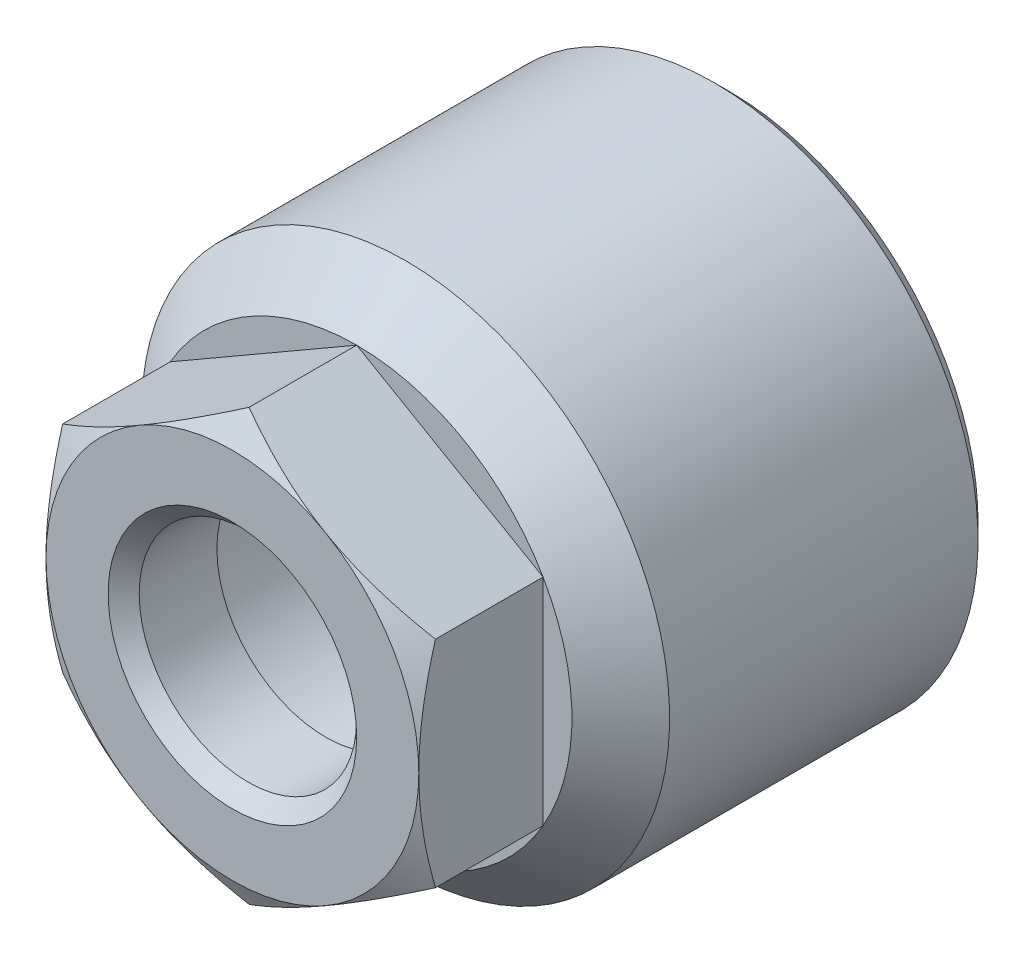
ISO-10303-21;
HEADER;
FILE_DESCRIPTION(('STEP AP214'),'2;1');
FILE_NAME('part.step','',(''),(''),'','','');
FILE_SCHEMA(('AUTOMOTIVE_DESIGN { 1 0 10303 214 1 1 1 1 }'));
ENDSEC;
DATA;
#1=APPLICATION_CONTEXT('core data for automotive mechanical design processes');
#2=APPLICATION_PROTOCOL_DEFINITION('international standard','automotive_design',2000,#1);
#3=PRODUCT_CONTEXT('',#1,'mechanical');
#4=PRODUCT('Part','Part','',(#3));
#5=PRODUCT_RELATED_PRODUCT_CATEGORY('part','',(#4));
#6=PRODUCT_DEFINITION_FORMATION('','',#4);
#7=PRODUCT_DEFINITION_CONTEXT('part definition',#1,'design');
#8=PRODUCT_DEFINITION('design','',#6,#7);
#9=PRODUCT_DEFINITION_SHAPE('','',#8);
#10=(LENGTH_UNIT() NAMED_UNIT(*) SI_UNIT(.MILLI.,.METRE.));
#11=(NAMED_UNIT(*) PLANE_ANGLE_UNIT() SI_UNIT($,.RADIAN.));
#12=(NAMED_UNIT(*) SI_UNIT($,.STERADIAN.) SOLID_ANGLE_UNIT());
#13=UNCERTAINTY_MEASURE_WITH_UNIT(LENGTH_MEASURE(1.E-05),#10,'distance_accuracy_value','');
#14=(GEOMETRIC_REPRESENTATION_CONTEXT(3) GLOBAL_UNCERTAINTY_ASSIGNED_CONTEXT((#13)) GLOBAL_UNIT_ASSIGNED_CONTEXT((#10,
#11,#12)) REPRESENTATION_CONTEXT('',''));
#15=CARTESIAN_POINT('',(0.,0.,0.));
#16=DIRECTION('',(0.,0.,1.));
#17=DIRECTION('',(1.,0.,0.));
#18=AXIS2_PLACEMENT_3D('',#15,#16,#17);
#19=CARTESIAN_POINT('',(11.9999999999999,6.92820323027565,-8.));
#20=DIRECTION('',(0.499999999999995,0.866025403784441,0.));
#21=DIRECTION('',(-0.866025403784441,0.499999999999995,0.));
#22=AXIS2_PLACEMENT_3D('',#19,#20,#21);
#23=PLANE('',#22);
#24=DIRECTION('',(0.,0.,1.));
#25=VECTOR('',#24,1.);
#26=CARTESIAN_POINT('',(0.,13.856406460551,-8.));
#27=LINE('',#26,#25);
#28=CARTESIAN_POINT('',(0.,13.856406460551,-8.));
#29=VERTEX_POINT('',#28);
#30=CARTESIAN_POINT('',(0.,13.856406460551,-1.07179676972444));
#31=VERTEX_POINT('',#30);
#32=EDGE_CURVE('E146',#29,#31,#27,.T.);
#33=ORIENTED_EDGE('',*,*,#32,.T.);
#34=CARTESIAN_POINT('',(-0.0002,13.8565219306049,-1.07186343722443));
#35=CARTESIAN_POINT('',(0.263585795242264,13.7042251307133,-0.983949632185819));
#36=CARTESIAN_POINT('',(0.528355119381802,13.5513604901482,-0.900025997556626));
#37=CARTESIAN_POINT('',(1.06001701652967,13.244405350712,-0.741266218872801));
#38=CARTESIAN_POINT('',(1.32691025729308,13.0903144663124,-0.666433063673542));
#39=CARTESIAN_POINT('',(2.13189040597902,12.6255589607763,-0.457017539854113));
#40=CARTESIAN_POINT('',(2.67315507382511,12.3130596590925,-0.337903236722815));
#41=CARTESIAN_POINT('',(3.48313282915501,11.8454187840152,-0.198231061003112));
#42=CARTESIAN_POINT('',(3.74942610048139,11.6916742921315,-0.158443797040413));
#43=CARTESIAN_POINT('',(4.28324559869686,11.3834734611381,-0.0917233692170604));
#44=CARTESIAN_POINT('',(4.5507718492174,11.2290171083848,-0.0647904527677457));
#45=CARTESIAN_POINT('',(5.08627036632538,10.9198468953819,-0.0244685919168988));
#46=CARTESIAN_POINT('',(5.35424172206875,10.7651335610083,-0.0110635528822929));
#47=CARTESIAN_POINT('',(5.89043273227407,10.4555635369293,0.00191690624285519));
#48=CARTESIAN_POINT('',(6.15865237880807,10.3007068518009,0.00149275363728714));
#49=CARTESIAN_POINT('',(6.66008937878413,10.0112020648831,-0.0122200193427528));
#50=CARTESIAN_POINT('',(6.89334249317778,9.87653331649861,-0.0238359825785117));
#51=CARTESIAN_POINT('',(7.35931224173078,9.60750555673731,-0.0573080088723605));
#52=CARTESIAN_POINT('',(7.59202883677178,9.4731465679455,-0.0791647962662012));
#53=CARTESIAN_POINT('',(8.05679907604294,9.20481134519097,-0.132737416542893));
#54=CARTESIAN_POINT('',(8.288852012362,9.07083551994092,-0.164461392492906));
#55=CARTESIAN_POINT('',(8.75186996730497,8.80351197901497,-0.237211775670422));
#56=CARTESIAN_POINT('',(8.98283491089352,8.67016430666075,-0.278238815183178));
#57=CARTESIAN_POINT('',(9.68394195876364,8.2653799638422,-0.41631165328178));
#58=CARTESIAN_POINT('',(10.1520537462785,7.99511549730967,-0.5271248883393));
#59=CARTESIAN_POINT('',(11.0812971075914,7.45861659251301,-0.77862576693785));
#60=CARTESIAN_POINT('',(11.5424405792921,7.19237528499157,-0.919254342659345));
#61=CARTESIAN_POINT('',(12.0001999999999,6.92808776022181,-1.07186343722443));
#62=B_SPLINE_CURVE_WITH_KNOTS('',3,(#34,#35,#36,#37,#38,#39,#40,#41,#42,#43,#44,#45,#46,#47,#48,
#49,#50,#51,#52,#53,#54,#55,#56,#57,#58,#59,#60,#61),.UNSPECIFIED.,.F.,.F.,(4,2,2,2,2,2,2,2,2,2,
2,2,2,4),(0.,0.951004872251246,1.90232158356438,3.80900466161369,4.73894551413571,
5.6689042647761,6.59775529889866,7.52657763276931,8.33514643820578,9.14377244252747,
9.95306755799761,10.7624176939263,12.4167102786891,14.067755631669),.UNSPECIFIED.);
#63=CARTESIAN_POINT('',(5.99999999999999,10.3923048454134,0.));
#64=VERTEX_POINT('',#63);
#65=EDGE_CURVE('E70',#31,#64,#62,.T.);
#66=ORIENTED_EDGE('',*,*,#65,.T.);
#67=CARTESIAN_POINT('',(11.9999999999999,6.92820323027565,-1.07179676972444));
#68=VERTEX_POINT('',#67);
#69=EDGE_CURVE('E117',#64,#68,#62,.T.);
#70=ORIENTED_EDGE('',*,*,#69,.T.);
#71=DIRECTION('',(0.,0.,1.));
#72=VECTOR('',#71,1.);
#73=CARTESIAN_POINT('',(11.9999999999999,6.92820323027565,-8.));
#74=LINE('',#73,#72);
#75=CARTESIAN_POINT('',(11.9999999999998,6.92820323027571,-7.99999999999996));
#76=VERTEX_POINT('',#75);
#77=EDGE_CURVE('E250',#76,#68,#74,.T.);
#78=ORIENTED_EDGE('',*,*,#77,.F.);
#79=DIRECTION('',(-0.866025403784441,0.499999999999995,0.));
#80=VECTOR('',#79,1.);
#81=CARTESIAN_POINT('',(11.9999999999999,6.92820323027565,-8.));
#82=LINE('',#81,#80);
#83=EDGE_CURVE('E422',#76,#29,#82,.T.);
#84=ORIENTED_EDGE('',*,*,#83,.T.);
#85=EDGE_LOOP('',(#33,#66,#70,#78,#84));
#86=FACE_BOUND('',#85,.T.);
#87=ADVANCED_FACE('F46',(#86),#23,.T.);
#88=CARTESIAN_POINT('',(12.0000000000001,-6.9282032302754,-8.));
#89=DIRECTION('',(1.,0.,0.));
#90=DIRECTION('',(0.,1.,0.));
#91=AXIS2_PLACEMENT_3D('',#88,#89,#90);
#92=PLANE('',#91);
#93=ORIENTED_EDGE('',*,*,#77,.T.);
#94=CARTESIAN_POINT('',(11.9999999999998,22.9284032302757,-8.01292205856069));
#95=CARTESIAN_POINT('',(11.9999999999998,22.3914038773246,-7.73826996089815));
#96=CARTESIAN_POINT('',(11.9999999999998,21.8535870807048,-7.46520156734985));
#97=CARTESIAN_POINT('',(11.9999999999998,20.775949369974,-6.92302201005071));
#98=CARTESIAN_POINT('',(11.9999999999998,20.2361284134909,-6.65391093056902));
#99=CARTESIAN_POINT('',(11.9999999999998,19.1532089274725,-6.11999050883258));
#100=CARTESIAN_POINT('',(11.9999999999998,18.6101063666815,-5.8551893280769));
#101=CARTESIAN_POINT('',(11.9999999999998,17.5210689493459,-5.33144602416146));
#102=CARTESIAN_POINT('',(11.9999999999998,16.9751340515705,-5.07250398659011));
#103=CARTESIAN_POINT('',(11.9999999999998,15.8519624269962,-4.54886615796039));
#104=CARTESIAN_POINT('',(11.9999999999998,15.2745483743149,-4.28454966307294));
#105=CARTESIAN_POINT('',(11.9999999999999,14.1151878281931,-3.76609444661759));
#106=CARTESIAN_POINT('',(11.9999999999999,13.5332415760901,-3.51195518748368));
#107=CARTESIAN_POINT('',(11.9999999999999,12.3641975501913,-3.01690552635542));
#108=CARTESIAN_POINT('',(11.9999999999999,11.7771035938207,-2.77598614814153));
#109=CARTESIAN_POINT('',(11.9999999999999,10.5960459363314,-2.31101275013836));
#110=CARTESIAN_POINT('',(11.9999999999999,10.0020805948474,-2.0869628575201));
#111=CARTESIAN_POINT('',(11.9999999999999,9.05181999011644,-1.74856276577053));
#112=CARTESIAN_POINT('',(11.9999999999999,8.69811619346075,-1.62695508814798));
#113=CARTESIAN_POINT('',(11.9999999999999,7.98771958508624,-1.3928259712592));
#114=CARTESIAN_POINT('',(11.9999999999999,7.63102667138014,-1.28030484342645));
#115=CARTESIAN_POINT('',(11.9999999999999,6.55643445068992,-0.958733729763835));
#116=CARTESIAN_POINT('',(11.9999999999999,5.83357958423612,-0.765514667030666));
#117=CARTESIAN_POINT('',(11.9999999999999,4.74645666585079,-0.51985263196518));
#118=CARTESIAN_POINT('',(12.,4.38701799906334,-0.445824709312143));
#119=CARTESIAN_POINT('',(12.,3.6652639874772,-0.313277091225055));
#120=CARTESIAN_POINT('',(12.,3.30294872042321,-0.254756978127329));
#121=CARTESIAN_POINT('',(12.,2.57610605370745,-0.154918538248956));
#122=CARTESIAN_POINT('',(12.,2.21157974521725,-0.113592331750669));
#123=CARTESIAN_POINT('',(12.,1.48088726329935,-0.0494438096510148));
#124=CARTESIAN_POINT('',(12.,1.11472110095573,-0.0266213691683051));
#125=CARTESIAN_POINT('',(12.,0.377402173746499,-0.000132405464725937));
#126=CARTESIAN_POINT('',(12.,0.00624114066922012,0.00330714157683311));
#127=CARTESIAN_POINT('',(12.,-0.735727355133803,-0.00970643523652931));
#128=CARTESIAN_POINT('',(12.,-1.10653481669313,-0.0261596244910789));
#129=CARTESIAN_POINT('',(12.,-1.84690043410361,-0.0783648733823472));
#130=CARTESIAN_POINT('',(12.,-2.21645814418443,-0.114123210912563));
#131=CARTESIAN_POINT('',(12.,-2.95334183650006,-0.203705544051641));
#132=CARTESIAN_POINT('',(12.,-3.3206677676507,-0.257529951608594));
#133=CARTESIAN_POINT('',(12.,-4.43267882588878,-0.446085792073235));
#134=CARTESIAN_POINT('',(12.0000000000001,-5.17304794526611,-0.606786574264474));
#135=CARTESIAN_POINT('',(12.0000000000001,-6.27309224914157,-0.887231827804943));
#136=CARTESIAN_POINT('',(12.0000000000001,-6.63808480252983,-0.987300129736838));
#137=CARTESIAN_POINT('',(12.0000000000001,-7.36481100466482,-1.19874844822463));
#138=CARTESIAN_POINT('',(12.0000000000001,-7.72654463252794,-1.31012853721188));
#139=CARTESIAN_POINT('',(12.0000000000001,-8.41775316117881,-1.53314339830441));
#140=CARTESIAN_POINT('',(12.0000000000001,-8.74747184641105,-1.64402967082626));
#141=CARTESIAN_POINT('',(12.0000000000001,-9.4044622923579,-1.87284520313324));
#142=CARTESIAN_POINT('',(12.0000000000001,-9.7317339717056,-1.99077469595528));
#143=CARTESIAN_POINT('',(12.0000000000001,-10.7102679375235,-2.35366353622876));
#144=CARTESIAN_POINT('',(12.0000000000001,-11.3581673861494,-2.60769632486128));
#145=CARTESIAN_POINT('',(12.0000000000001,-12.6471555923902,-3.13398837887719));
#146=CARTESIAN_POINT('',(12.0000000000001,-13.2882373091201,-3.40626469925147));
#147=CARTESIAN_POINT('',(12.0000000000002,-14.564369025296,-3.96441593510737));
#148=CARTESIAN_POINT('',(12.0000000000002,-15.1994195086154,-4.2502897484428));
#149=CARTESIAN_POINT('',(12.0000000000002,-16.4310266296783,-4.81697923189874));
#150=CARTESIAN_POINT('',(12.0000000000002,-17.0278330742653,-5.09725427553586));
#151=CARTESIAN_POINT('',(12.0000000000002,-18.2179326575289,-5.66519384067006));
#152=CARTESIAN_POINT('',(12.0000000000002,-18.8112256971348,-5.95285856933147));
#153=CARTESIAN_POINT('',(12.0000000000002,-19.9932102007579,-6.53324968369327));
#154=CARTESIAN_POINT('',(12.0000000000002,-20.58190998969,-6.82595914322132));
#155=CARTESIAN_POINT('',(12.0000000000002,-21.4631432450724,-7.26857581310798));
#156=CARTESIAN_POINT('',(12.0000000000002,-21.756573894556,-7.41670113041807));
#157=CARTESIAN_POINT('',(12.0000000000002,-22.342886784872,-7.71402997161241));
#158=CARTESIAN_POINT('',(12.0000000000002,-22.6357690282501,-7.86323349047591));
#159=CARTESIAN_POINT('',(12.0000000000002,-22.9284032302754,-8.0129220585607));
#160=B_SPLINE_CURVE_WITH_KNOTS('',3,(#94,#95,#96,#97,#98,#99,#100,#101,#102,#103,#104,#105,#106,
#107,#108,#109,#110,#111,#112,#113,#114,#115,#116,#117,#118,#119,#120,#121,#122,#123,#124,#125,
#126,#127,#128,#129,#130,#131,#132,#133,#134,#135,#136,#137,#138,#139,#140,#141,#142,#143,#144,
#145,#146,#147,#148,#149,#150,#151,#152,#153,#154,#155,#156,#157,#158,#159),.UNSPECIFIED.,.F.,
.F.,(4,2,2,2,2,2,2,2,2,2,2,2,2,2,2,2,2,2,2,2,2,2,2,2,2,2,2,2,2,2,2,2,4),(0.,1.809487490861,
3.61901345827234,5.43164016622181,7.24429333534566,9.14932416501831,11.0542542370534,
12.957874447692,14.8619588816329,15.9839158744573,17.1059113050622,19.3484919651268,
20.4491705858187,21.5498195594988,22.6499635646459,23.7501001448935,24.8630931133416,
25.9760897408903,27.0894485250328,28.20283269805,30.472607912963,31.6078912205663,
32.7431817980458,33.7866935981331,34.8302399437286,36.917590703643,39.0069208121503,
41.096081857424,43.074047795846,45.0520692457194,47.0244050092042,48.0104985229254,
48.9965874477745),.UNSPECIFIED.);
#161=CARTESIAN_POINT('',(12.0000000000001,1.26194426293922E-13,0.));
#162=VERTEX_POINT('',#161);
#163=EDGE_CURVE('E120',#68,#162,#160,.T.);
#164=ORIENTED_EDGE('',*,*,#163,.T.);
#165=CARTESIAN_POINT('',(12.0000000000001,-6.9282032302754,-1.07179676972444));
#166=VERTEX_POINT('',#165);
#167=EDGE_CURVE('E158',#162,#166,#160,.T.);
#168=ORIENTED_EDGE('',*,*,#167,.T.);
#169=DIRECTION('',(0.,0.,1.));
#170=VECTOR('',#169,1.);
#171=CARTESIAN_POINT('',(12.0000000000001,-6.9282032302754,-8.));
#172=LINE('',#171,#170);
#173=CARTESIAN_POINT('',(12.0000000000001,-6.92820323027503,-7.99999999999989));
#174=VERTEX_POINT('',#173);
#175=EDGE_CURVE('E254',#174,#166,#172,.T.);
#176=ORIENTED_EDGE('',*,*,#175,.F.);
#177=DIRECTION('',(0.,1.,0.));
#178=VECTOR('',#177,1.);
#179=CARTESIAN_POINT('',(12.0000000000001,-6.9282032302754,-8.));
#180=LINE('',#179,#178);
#181=EDGE_CURVE('E253',#174,#76,#180,.T.);
#182=ORIENTED_EDGE('',*,*,#181,.T.);
#183=EDGE_LOOP('',(#93,#164,#168,#176,#182));
#184=FACE_BOUND('',#183,.T.);
#185=ADVANCED_FACE('F217',(#184),#92,.T.);
#186=CARTESIAN_POINT('',(0.,-13.856406460551,-8.));
#187=DIRECTION('',(0.500000000000007,-0.866025403784435,0.));
#188=DIRECTION('',(0.866025403784435,0.500000000000007,0.));
#189=AXIS2_PLACEMENT_3D('',#186,#187,#188);
#190=PLANE('',#189);
#191=ORIENTED_EDGE('',*,*,#175,.T.);
#192=CARTESIAN_POINT('',(12.0002000000001,-6.92808776022156,-1.07186343722443));
#193=CARTESIAN_POINT('',(11.7364142047578,-7.08038456011308,-0.983949632185816));
#194=CARTESIAN_POINT('',(11.4716448806183,-7.2332492006782,-0.900025997556622));
#195=CARTESIAN_POINT('',(10.9399829834704,-7.54020434011439,-0.741266218872796));
#196=CARTESIAN_POINT('',(10.673089742707,-7.69429522451404,-0.666433063673537));
#197=CARTESIAN_POINT('',(9.86810959402107,-8.15905073005018,-0.457017539854105));
#198=CARTESIAN_POINT('',(9.32684492617498,-8.47155003173396,-0.337903236722801));
#199=CARTESIAN_POINT('',(8.51686717084509,-8.93919090681129,-0.198231061003096));
#200=CARTESIAN_POINT('',(8.25057389951871,-9.09293539869496,-0.158443797040396));
#201=CARTESIAN_POINT('',(7.71675440130325,-9.40113622968834,-0.0917233692170419));
#202=CARTESIAN_POINT('',(7.44922815078271,-9.55559258244167,-0.0647904527677252));
#203=CARTESIAN_POINT('',(6.91372963367474,-9.8647627954446,-0.0244685919168753));
#204=CARTESIAN_POINT('',(6.64575827793136,-10.0194761298182,-0.0110635528822682));
#205=CARTESIAN_POINT('',(6.10956726772606,-10.3290461538973,0.00191690624288258));
#206=CARTESIAN_POINT('',(5.84134762119206,-10.4839028390256,0.00149275363731606));
#207=CARTESIAN_POINT('',(5.33991062121599,-10.7734076259434,-0.012220019342722));
#208=CARTESIAN_POINT('',(5.10665750682234,-10.9080763743279,-0.0238359825784806));
#209=CARTESIAN_POINT('',(4.64068775826933,-11.1771041340892,-0.0573080088723289));
#210=CARTESIAN_POINT('',(4.40797116322833,-11.3114631228811,-0.0791647962661692));
#211=CARTESIAN_POINT('',(3.94320092395715,-11.5797983456356,-0.132737416542861));
#212=CARTESIAN_POINT('',(3.71114798763809,-11.7137741708856,-0.164461392492875));
#213=CARTESIAN_POINT('',(3.24813003269512,-11.9810977118116,-0.237211775670392));
#214=CARTESIAN_POINT('',(3.01716508910656,-12.1144453841658,-0.27823881518315));
#215=CARTESIAN_POINT('',(2.31605804123643,-12.5192297269844,-0.416311653281756));
#216=CARTESIAN_POINT('',(1.84794625372157,-12.789494193517,-0.527124888339279));
#217=CARTESIAN_POINT('',(0.918702892408676,-13.3259930983136,-0.778625766937838));
#218=CARTESIAN_POINT('',(0.457559420707943,-13.5922344058351,-0.919254342659338));
#219=CARTESIAN_POINT('',(-0.000199999999903364,-13.8565219306049,-1.07186343722443));
#220=B_SPLINE_CURVE_WITH_KNOTS('',3,(#192,#193,#194,#195,#196,#197,#198,#199,#200,#201,#202,
#203,#204,#205,#206,#207,#208,#209,#210,#211,#212,#213,#214,#215,#216,#217,#218,#219),
.UNSPECIFIED.,.F.,.F.,(4,2,2,2,2,2,2,2,2,2,2,2,2,4),(0.,0.951004872251245,1.90232158356438,
3.80900466161369,4.73894551413571,5.6689042647761,6.59775529889866,7.52657763276931,
8.3351464382058,9.1437724425275,9.95306755799767,10.7624176939264,12.4167102786892,
14.0677556316692),.UNSPECIFIED.);
#221=CARTESIAN_POINT('',(6.00000000000013,-10.3923048454133,0.));
#222=VERTEX_POINT('',#221);
#223=EDGE_CURVE('E211',#166,#222,#220,.T.);
#224=ORIENTED_EDGE('',*,*,#223,.T.);
#225=CARTESIAN_POINT('',(0.,-13.856406460551,-1.07179676972444));
#226=VERTEX_POINT('',#225);
#227=EDGE_CURVE('E204',#222,#226,#220,.T.);
#228=ORIENTED_EDGE('',*,*,#227,.T.);
#229=DIRECTION('',(0.,0.,1.));
#230=VECTOR('',#229,1.);
#231=CARTESIAN_POINT('',(0.,-13.856406460551,-8.));
#232=LINE('',#231,#230);
#233=CARTESIAN_POINT('',(5.27355936696949E-13,-13.8564064605508,-7.99999999999985));
#234=VERTEX_POINT('',#233);
#235=EDGE_CURVE('E258',#234,#226,#232,.T.);
#236=ORIENTED_EDGE('',*,*,#235,.F.);
#237=DIRECTION('',(0.866025403784435,0.500000000000007,0.));
#238=VECTOR('',#237,1.);
#239=CARTESIAN_POINT('',(0.,-13.856406460551,-8.));
#240=LINE('',#239,#238);
#241=EDGE_CURVE('E408',#234,#174,#240,.T.);
#242=ORIENTED_EDGE('',*,*,#241,.T.);
#243=EDGE_LOOP('',(#191,#224,#228,#236,#242));
#244=FACE_BOUND('',#243,.T.);
#245=ADVANCED_FACE('F213',(#244),#190,.T.);
#246=CARTESIAN_POINT('',(-12.,-6.92820323027557,-8.));
#247=DIRECTION('',(-0.499999999999995,-0.866025403784442,0.));
#248=DIRECTION('',(0.866025403784442,-0.499999999999995,0.));
#249=AXIS2_PLACEMENT_3D('',#246,#247,#248);
#250=PLANE('',#249);
#251=ORIENTED_EDGE('',*,*,#235,.T.);
#252=CARTESIAN_POINT('',(0.000200000000096759,-13.8565219306049,-1.07186343722443));
#253=CARTESIAN_POINT('',(-0.263585795242165,-13.7042251307133,-0.983949632185815));
#254=CARTESIAN_POINT('',(-0.528355119381704,-13.5513604901482,-0.900025997556621));
#255=CARTESIAN_POINT('',(-1.06001701652957,-13.244405350712,-0.741266218872795));
#256=CARTESIAN_POINT('',(-1.32691025729298,-13.0903144663124,-0.666433063673536));
#257=CARTESIAN_POINT('',(-2.13189040597892,-12.6255589607763,-0.457017539854104));
#258=CARTESIAN_POINT('',(-2.67315507382501,-12.3130596590925,-0.3379032367228));
#259=CARTESIAN_POINT('',(-3.48313282915491,-11.8454187840152,-0.198231061003095));
#260=CARTESIAN_POINT('',(-3.74942610048129,-11.6916742921315,-0.158443797040396));
#261=CARTESIAN_POINT('',(-4.28324559869676,-11.3834734611381,-0.0917233692170418));
#262=CARTESIAN_POINT('',(-4.5507718492173,-11.2290171083848,-0.0647904527677247));
#263=CARTESIAN_POINT('',(-5.08627036632528,-10.9198468953819,-0.0244685919168747));
#264=CARTESIAN_POINT('',(-5.35424172206865,-10.7651335610083,-0.011063552882268));
#265=CARTESIAN_POINT('',(-5.89043273227397,-10.4555635369293,0.00191690624288241));
#266=CARTESIAN_POINT('',(-6.15865237880797,-10.3007068518009,0.00149275363731601));
#267=CARTESIAN_POINT('',(-6.66008937878404,-10.0112020648831,-0.0122200193427219));
#268=CARTESIAN_POINT('',(-6.89334249317769,-9.8765333164986,-0.0238359825784806));
#269=CARTESIAN_POINT('',(-7.35931224173071,-9.6075055567373,-0.0573080088723284));
#270=CARTESIAN_POINT('',(-7.59202883677171,-9.47314656794548,-0.0791647962661683));
#271=CARTESIAN_POINT('',(-8.05679907604289,-9.20481134519094,-0.13273741654286));
#272=CARTESIAN_POINT('',(-8.28885201236195,-9.07083551994089,-0.164461392492875));
#273=CARTESIAN_POINT('',(-8.75186996730493,-8.80351197901494,-0.237211775670392));
#274=CARTESIAN_POINT('',(-8.98283491089349,-8.67016430666071,-0.27823881518315));
#275=CARTESIAN_POINT('',(-9.68394195876363,-8.26537996384215,-0.416311653281756));
#276=CARTESIAN_POINT('',(-10.1520537462785,-7.99511549730961,-0.52712488833928));
#277=CARTESIAN_POINT('',(-11.0812971075914,-7.45861659251295,-0.778625766937839));
#278=CARTESIAN_POINT('',(-11.5424405792921,-7.19237528499149,-0.919254342659339));
#279=CARTESIAN_POINT('',(-12.0002,-6.92808776022173,-1.07186343722443));
#280=B_SPLINE_CURVE_WITH_KNOTS('',3,(#252,#253,#254,#255,#256,#257,#258,#259,#260,#261,#262,
#263,#264,#265,#266,#267,#268,#269,#270,#271,#272,#273,#274,#275,#276,#277,#278,#279),
.UNSPECIFIED.,.F.,.F.,(4,2,2,2,2,2,2,2,2,2,2,2,2,4),(0.,0.951004872251244,1.90232158356438,
3.80900466161369,4.73894551413571,5.6689042647761,6.59775529889866,7.52657763276931,
8.3351464382058,9.1437724425275,9.95306755799767,10.7624176939264,12.4167102786892,
14.0677556316692),.UNSPECIFIED.);
#281=CARTESIAN_POINT('',(-5.99999999999998,-10.3923048454134,0.));
#282=VERTEX_POINT('',#281);
#283=EDGE_CURVE('E212',#226,#282,#280,.T.);
#284=ORIENTED_EDGE('',*,*,#283,.T.);
#285=CARTESIAN_POINT('',(-12.,-6.92820323027557,-1.07179676972444));
#286=VERTEX_POINT('',#285);
#287=EDGE_CURVE('E198',#282,#286,#280,.T.);
#288=ORIENTED_EDGE('',*,*,#287,.T.);
#289=DIRECTION('',(0.,0.,1.));
#290=VECTOR('',#289,1.);
#291=CARTESIAN_POINT('',(-12.,-6.92820323027557,-8.));
#292=LINE('',#291,#290);
#293=CARTESIAN_POINT('',(-11.9999999999997,-6.92820323027575,-7.99999999999989));
#294=VERTEX_POINT('',#293);
#295=EDGE_CURVE('E265',#294,#286,#292,.T.);
#296=ORIENTED_EDGE('',*,*,#295,.F.);
#297=DIRECTION('',(0.866025403784441,-0.499999999999995,0.));
#298=VECTOR('',#297,1.);
#299=CARTESIAN_POINT('',(-12.,-6.92820323027557,-8.));
#300=LINE('',#299,#298);
#301=EDGE_CURVE('E413',#294,#234,#300,.T.);
#302=ORIENTED_EDGE('',*,*,#301,.T.);
#303=EDGE_LOOP('',(#251,#284,#288,#296,#302));
#304=FACE_BOUND('',#303,.T.);
#305=ADVANCED_FACE('F216',(#304),#250,.T.);
#306=CARTESIAN_POINT('',(-12.,6.92820323027549,-8.));
#307=DIRECTION('',(-1.,0.,0.));
#308=DIRECTION('',(0.,-1.,0.));
#309=AXIS2_PLACEMENT_3D('',#306,#307,#308);
#310=PLANE('',#309);
#311=ORIENTED_EDGE('',*,*,#295,.T.);
#312=CARTESIAN_POINT('',(-11.9999999999999,-22.9284032302756,-8.0129220585607));
#313=CARTESIAN_POINT('',(-11.9999999999999,-22.3914038773245,-7.73826996089815));
#314=CARTESIAN_POINT('',(-11.9999999999999,-21.8535870807047,-7.46520156734985));
#315=CARTESIAN_POINT('',(-11.9999999999999,-20.7759493699739,-6.92302201005071));
#316=CARTESIAN_POINT('',(-11.9999999999999,-20.2361284134909,-6.65391093056902));
#317=CARTESIAN_POINT('',(-11.9999999999999,-19.1532089274724,-6.11999050883259));
#318=CARTESIAN_POINT('',(-11.9999999999999,-18.6101063666814,-5.8551893280769));
#319=CARTESIAN_POINT('',(-11.9999999999999,-17.5210689493458,-5.33144602416146));
#320=CARTESIAN_POINT('',(-11.9999999999999,-16.9751340515704,-5.07250398659011));
#321=CARTESIAN_POINT('',(-11.9999999999999,-15.8519624269961,-4.54886615796039));
#322=CARTESIAN_POINT('',(-11.9999999999999,-15.2745483743148,-4.28454966307294));
#323=CARTESIAN_POINT('',(-12.,-14.115187828193,-3.76609444661759));
#324=CARTESIAN_POINT('',(-12.,-13.53324157609,-3.51195518748368));
#325=CARTESIAN_POINT('',(-12.,-12.3641975501912,-3.01690552635542));
#326=CARTESIAN_POINT('',(-12.,-11.7771035938207,-2.77598614814153));
#327=CARTESIAN_POINT('',(-12.,-10.5960459363313,-2.31101275013836));
#328=CARTESIAN_POINT('',(-12.,-10.0020805948473,-2.0869628575201));
#329=CARTESIAN_POINT('',(-12.,-9.05181999011636,-1.74856276577053));
#330=CARTESIAN_POINT('',(-12.,-8.69811619346068,-1.62695508814798));
#331=CARTESIAN_POINT('',(-12.,-7.98771958508616,-1.3928259712592));
#332=CARTESIAN_POINT('',(-12.,-7.63102667138007,-1.28030484342645));
#333=CARTESIAN_POINT('',(-12.,-6.55643445068984,-0.95873372976384));
#334=CARTESIAN_POINT('',(-12.,-5.83357958423604,-0.76551466703067));
#335=CARTESIAN_POINT('',(-12.,-4.74645666585071,-0.519852631965183));
#336=CARTESIAN_POINT('',(-12.,-4.38701799906327,-0.445824709312146));
#337=CARTESIAN_POINT('',(-12.,-3.66526398747713,-0.313277091225058));
#338=CARTESIAN_POINT('',(-12.,-3.30294872042314,-0.254756978127332));
#339=CARTESIAN_POINT('',(-12.,-2.57610605370738,-0.154918538248958));
#340=CARTESIAN_POINT('',(-12.,-2.21157974521718,-0.113592331750671));
#341=CARTESIAN_POINT('',(-12.,-1.48088726329927,-0.0494438096510158));
#342=CARTESIAN_POINT('',(-12.,-1.11472110095566,-0.0266213691683067));
#343=CARTESIAN_POINT('',(-12.,-0.377402173746427,-0.000132405464727558));
#344=CARTESIAN_POINT('',(-12.,-0.00624114066914716,0.00330714157683195));
#345=CARTESIAN_POINT('',(-12.,0.735727355133876,-0.00970643523653015));
#346=CARTESIAN_POINT('',(-12.,1.1065348166932,-0.0261596244910799));
#347=CARTESIAN_POINT('',(-12.,1.84690043410368,-0.078364873382347));
#348=CARTESIAN_POINT('',(-12.,2.2164581441845,-0.114123210912561));
#349=CARTESIAN_POINT('',(-12.,2.95334183650014,-0.203705544051639));
#350=CARTESIAN_POINT('',(-12.,3.32066776765077,-0.257529951608592));
#351=CARTESIAN_POINT('',(-12.,4.43267882588885,-0.446085792073233));
#352=CARTESIAN_POINT('',(-12.,5.17304794526618,-0.606786574264472));
#353=CARTESIAN_POINT('',(-12.,6.27309224914164,-0.88723182780494));
#354=CARTESIAN_POINT('',(-12.,6.6380848025299,-0.987300129736835));
#355=CARTESIAN_POINT('',(-12.,7.36481100466489,-1.19874844822463));
#356=CARTESIAN_POINT('',(-12.,7.726544632528,-1.31012853721188));
#357=CARTESIAN_POINT('',(-12.,8.41775316117888,-1.53314339830441));
#358=CARTESIAN_POINT('',(-12.,8.74747184641112,-1.64402967082626));
#359=CARTESIAN_POINT('',(-12.,9.40446229235797,-1.87284520313324));
#360=CARTESIAN_POINT('',(-12.,9.73173397170567,-1.99077469595527));
#361=CARTESIAN_POINT('',(-12.,10.7102679375236,-2.35366353622875));
#362=CARTESIAN_POINT('',(-12.,11.3581673861495,-2.60769632486127));
#363=CARTESIAN_POINT('',(-12.,12.6471555923902,-3.13398837887719));
#364=CARTESIAN_POINT('',(-12.,13.2882373091202,-3.40626469925146));
#365=CARTESIAN_POINT('',(-12.,14.564369025296,-3.96441593510736));
#366=CARTESIAN_POINT('',(-12.,15.1994195086154,-4.25028974844279));
#367=CARTESIAN_POINT('',(-12.0000000000001,16.4310266296783,-4.81697923189874));
#368=CARTESIAN_POINT('',(-12.0000000000001,17.0278330742654,-5.09725427553586));
#369=CARTESIAN_POINT('',(-12.0000000000001,18.217932657529,-5.66519384067006));
#370=CARTESIAN_POINT('',(-12.0000000000001,18.8112256971349,-5.95285856933147));
#371=CARTESIAN_POINT('',(-12.0000000000001,19.993210200758,-6.53324968369327));
#372=CARTESIAN_POINT('',(-12.0000000000001,20.58190998969,-6.82595914322132));
#373=CARTESIAN_POINT('',(-12.0000000000001,21.4631432450725,-7.26857581310798));
#374=CARTESIAN_POINT('',(-12.0000000000001,21.7565738945561,-7.41670113041807));
#375=CARTESIAN_POINT('',(-12.0000000000001,22.3428867848721,-7.71402997161241));
#376=CARTESIAN_POINT('',(-12.0000000000001,22.6357690282501,-7.86323349047591));
#377=CARTESIAN_POINT('',(-12.0000000000001,22.9284032302755,-8.0129220585607));
#378=B_SPLINE_CURVE_WITH_KNOTS('',3,(#312,#313,#314,#315,#316,#317,#318,#319,#320,#321,#322,
#323,#324,#325,#326,#327,#328,#329,#330,#331,#332,#333,#334,#335,#336,#337,#338,#339,#340,#341,
#342,#343,#344,#345,#346,#347,#348,#349,#350,#351,#352,#353,#354,#355,#356,#357,#358,#359,#360,
#361,#362,#363,#364,#365,#366,#367,#368,#369,#370,#371,#372,#373,#374,#375,#376,#377),
.UNSPECIFIED.,.F.,.F.,(4,2,2,2,2,2,2,2,2,2,2,2,2,2,2,2,2,2,2,2,2,2,2,2,2,2,2,2,2,2,2,2,4),(0.,
1.809487490861,3.61901345827234,5.43164016622181,7.24429333534566,9.14932416501831,
11.0542542370534,12.957874447692,14.8619588816329,15.9839158744573,17.1059113050622,
19.3484919651268,20.4491705858187,21.5498195594988,22.6499635646459,23.7501001448935,
24.8630931133416,25.9760897408903,27.0894485250328,28.20283269805,30.472607912963,
31.6078912205662,32.7431817980458,33.7866935981331,34.8302399437286,36.9175907036429,
39.0069208121503,41.096081857424,43.0740477958459,45.0520692457194,47.0244050092042,
48.0104985229254,48.9965874477745),.UNSPECIFIED.);
#379=CARTESIAN_POINT('',(-12.0000000000001,0.,0.));
#380=VERTEX_POINT('',#379);
#381=EDGE_CURVE('E639',#286,#380,#378,.T.);
#382=ORIENTED_EDGE('',*,*,#381,.T.);
#383=CARTESIAN_POINT('',(-12.,6.92820323027548,-1.07179676972444));
#384=VERTEX_POINT('',#383);
#385=EDGE_CURVE('E191',#380,#384,#378,.T.);
#386=ORIENTED_EDGE('',*,*,#385,.T.);
#387=DIRECTION('',(0.,0.,1.));
#388=VECTOR('',#387,1.);
#389=CARTESIAN_POINT('',(-12.,6.92820323027549,-8.));
#390=LINE('',#389,#388);
#391=CARTESIAN_POINT('',(-12.,6.92820323027549,-8.));
#392=VERTEX_POINT('',#391);
#393=EDGE_CURVE('E268',#392,#384,#390,.T.);
#394=ORIENTED_EDGE('',*,*,#393,.F.);
#395=DIRECTION('',(0.,-1.,0.));
#396=VECTOR('',#395,1.);
#397=CARTESIAN_POINT('',(-12.,6.92820323027549,-8.));
#398=LINE('',#397,#396);
#399=EDGE_CURVE('E414',#392,#294,#398,.T.);
#400=ORIENTED_EDGE('',*,*,#399,.T.);
#401=EDGE_LOOP('',(#311,#382,#386,#394,#400));
#402=FACE_BOUND('',#401,.T.);
#403=ADVANCED_FACE('F223',(#402),#310,.T.);
#404=CARTESIAN_POINT('',(0.,13.856406460551,-8.));
#405=DIRECTION('',(-0.500000000000001,0.866025403784438,0.));
#406=DIRECTION('',(-0.866025403784438,-0.500000000000001,0.));
#407=AXIS2_PLACEMENT_3D('',#404,#405,#406);
#408=PLANE('',#407);
#409=ORIENTED_EDGE('',*,*,#393,.T.);
#410=CARTESIAN_POINT('',(-12.0002,6.92808776022165,-1.07186343722443));
#411=CARTESIAN_POINT('',(-11.7364142047578,7.08038456011317,-0.983949632185817));
#412=CARTESIAN_POINT('',(-11.4716448806182,7.23324920067828,-0.900025997556623));
#413=CARTESIAN_POINT('',(-10.9399829834704,7.54020434011447,-0.741266218872796));
#414=CARTESIAN_POINT('',(-10.673089742707,7.69429522451412,-0.666433063673537));
#415=CARTESIAN_POINT('',(-9.86810959402102,8.15905073005025,-0.457017539854103));
#416=CARTESIAN_POINT('',(-9.32684492617492,8.47155003173402,-0.337903236722802));
#417=CARTESIAN_POINT('',(-8.51686717084503,8.93919090681135,-0.198231061003096));
#418=CARTESIAN_POINT('',(-8.25057389951865,9.09293539869502,-0.158443797040396));
#419=CARTESIAN_POINT('',(-7.71675440130318,9.40113622968839,-0.0917233692170419));
#420=CARTESIAN_POINT('',(-7.44922815078264,9.55559258244172,-0.0647904527677256));
#421=CARTESIAN_POINT('',(-6.91372963367467,9.86476279544465,-0.0244685919168753));
#422=CARTESIAN_POINT('',(-6.6457582779313,10.0194761298182,-0.0110635528822677));
#423=CARTESIAN_POINT('',(-6.10956726772598,10.3290461538973,0.00191690624288308));
#424=CARTESIAN_POINT('',(-5.84134762119198,10.4839028390256,0.00149275363731604));
#425=CARTESIAN_POINT('',(-5.33991062121592,10.7734076259435,-0.0122200193427224));
#426=CARTESIAN_POINT('',(-5.10665750682227,10.908076374328,-0.023835982578481));
#427=CARTESIAN_POINT('',(-4.64068775826925,11.1771041340893,-0.0573080088723291));
#428=CARTESIAN_POINT('',(-4.40797116322825,11.3114631228811,-0.0791647962661695));
#429=CARTESIAN_POINT('',(-3.94320092395707,11.5797983456356,-0.132737416542861));
#430=CARTESIAN_POINT('',(-3.71114798763801,11.7137741708857,-0.164461392492875));
#431=CARTESIAN_POINT('',(-3.24813003269503,11.9810977118116,-0.237211775670392));
#432=CARTESIAN_POINT('',(-3.01716508910647,12.1144453841659,-0.27823881518315));
#433=CARTESIAN_POINT('',(-2.31605804123634,12.5192297269844,-0.416311653281756));
#434=CARTESIAN_POINT('',(-1.84794625372148,12.789494193517,-0.52712488833928));
#435=CARTESIAN_POINT('',(-0.918702892408584,13.3259930983136,-0.778625766937839));
#436=CARTESIAN_POINT('',(-0.457559420707849,13.5922344058351,-0.91925434265934));
#437=CARTESIAN_POINT('',(0.000199999999997791,13.8565219306049,-1.07186343722443));
#438=B_SPLINE_CURVE_WITH_KNOTS('',3,(#410,#411,#412,#413,#414,#415,#416,#417,#418,#419,#420,
#421,#422,#423,#424,#425,#426,#427,#428,#429,#430,#431,#432,#433,#434,#435,#436,#437),
.UNSPECIFIED.,.F.,.F.,(4,2,2,2,2,2,2,2,2,2,2,2,2,4),(0.,0.951004872251245,1.90232158356437,
3.80900466161369,4.73894551413571,5.6689042647761,6.59775529889866,7.52657763276931,
8.33514643820579,9.1437724425275,9.95306755799767,10.7624176939264,12.4167102786892,
14.0677556316692),.UNSPECIFIED.);
#439=CARTESIAN_POINT('',(-6.00000000000006,10.3923048454133,0.));
#440=VERTEX_POINT('',#439);
#441=EDGE_CURVE('E643',#384,#440,#438,.T.);
#442=ORIENTED_EDGE('',*,*,#441,.T.);
#443=EDGE_CURVE('E128',#440,#31,#438,.T.);
#444=ORIENTED_EDGE('',*,*,#443,.T.);
#445=ORIENTED_EDGE('',*,*,#32,.F.);
#446=DIRECTION('',(-0.866025403784438,-0.500000000000001,0.));
#447=VECTOR('',#446,1.);
#448=CARTESIAN_POINT('',(0.,13.856406460551,-8.));
#449=LINE('',#448,#447);
#450=EDGE_CURVE('E419',#29,#392,#449,.T.);
#451=ORIENTED_EDGE('',*,*,#450,.T.);
#452=EDGE_LOOP('',(#409,#442,#444,#445,#451));
#453=FACE_BOUND('',#452,.T.);
#454=ADVANCED_FACE('F227',(#453),#408,.T.);
#455=CARTESIAN_POINT('',(0.,1.2490009027033E-13,-7.99999999999996));
#456=DIRECTION('',(0.,0.,1.));
#457=DIRECTION('',(0.,-1.,0.));
#458=AXIS2_PLACEMENT_3D('',#455,#456,#457);
#459=PLANE('',#458);
#460=ORIENTED_EDGE('',*,*,#83,.F.);
#461=CARTESIAN_POINT('',(0.,1.2490009027033E-13,-7.99999999999993));
#462=DIRECTION('',(0.,0.,-1.));
#463=DIRECTION('',(0.,1.,0.));
#464=AXIS2_PLACEMENT_3D('',#461,#462,#463);
#465=CIRCLE('',#464,13.8564064605509);
#466=EDGE_CURVE('E423',#29,#76,#465,.T.);
#467=ORIENTED_EDGE('',*,*,#466,.F.);
#468=EDGE_LOOP('',(#460,#467));
#469=FACE_BOUND('',#468,.T.);
#470=ADVANCED_FACE('F231',(#469),#459,.T.);
#471=ORIENTED_EDGE('',*,*,#181,.F.);
#472=EDGE_CURVE('E425',#76,#174,#465,.T.);
#473=ORIENTED_EDGE('',*,*,#472,.F.);
#474=EDGE_LOOP('',(#471,#473));
#475=FACE_BOUND('',#474,.T.);
#476=ADVANCED_FACE('F237',(#475),#459,.T.);
#477=ORIENTED_EDGE('',*,*,#241,.F.);
#478=EDGE_CURVE('E429',#174,#234,#465,.T.);
#479=ORIENTED_EDGE('',*,*,#478,.F.);
#480=EDGE_LOOP('',(#477,#479));
#481=FACE_BOUND('',#480,.T.);
#482=ADVANCED_FACE('F439',(#481),#459,.T.);
#483=ORIENTED_EDGE('',*,*,#301,.F.);
#484=EDGE_CURVE('E432',#234,#294,#465,.T.);
#485=ORIENTED_EDGE('',*,*,#484,.F.);
#486=EDGE_LOOP('',(#483,#485));
#487=FACE_BOUND('',#486,.T.);
#488=ADVANCED_FACE('F441',(#487),#459,.T.);
#489=ORIENTED_EDGE('',*,*,#399,.F.);
#490=EDGE_CURVE('E430',#294,#392,#465,.T.);
#491=ORIENTED_EDGE('',*,*,#490,.F.);
#492=EDGE_LOOP('',(#489,#491));
#493=FACE_BOUND('',#492,.T.);
#494=ADVANCED_FACE('F446',(#493),#459,.T.);
#495=ORIENTED_EDGE('',*,*,#450,.F.);
#496=EDGE_CURVE('E149',#392,#29,#465,.T.);
#497=ORIENTED_EDGE('',*,*,#496,.F.);
#498=EDGE_LOOP('',(#495,#497));
#499=FACE_BOUND('',#498,.T.);
#500=ADVANCED_FACE('F239',(#499),#459,.T.);
#501=CARTESIAN_POINT('',(0.,0.,-32.));
#502=DIRECTION('',(0.,0.,-1.));
#503=DIRECTION('',(0.,1.,0.));
#504=AXIS2_PLACEMENT_3D('',#501,#502,#503);
#505=CYLINDRICAL_SURFACE('',#504,16.9999999999999);
#506=CARTESIAN_POINT('',(0.,0.,-31.));
#507=DIRECTION('',(0.,0.,-1.));
#508=DIRECTION('',(0.,1.,0.));
#509=AXIS2_PLACEMENT_3D('',#506,#507,#508);
#510=CIRCLE('',#509,16.9999999999999);
#511=CARTESIAN_POINT('',(0.,17.,-31.0000000000001));
#512=VERTEX_POINT('',#511);
#513=EDGE_CURVE('E273',#512,#512,#510,.F.);
#514=ORIENTED_EDGE('',*,*,#513,.T.);
#515=EDGE_LOOP('',(#514));
#516=FACE_BOUND('',#515,.T.);
#517=CARTESIAN_POINT('',(0.,1.08540293734897E-13,-11.1435935394489));
#518=DIRECTION('',(0.,0.,-1.));
#519=DIRECTION('',(0.,1.,0.));
#520=AXIS2_PLACEMENT_3D('',#517,#518,#519);
#521=CIRCLE('',#520,16.9999999999999);
#522=CARTESIAN_POINT('',(0.,17.,-11.143593539449));
#523=VERTEX_POINT('',#522);
#524=EDGE_CURVE('E147',#523,#523,#521,.T.);
#525=ORIENTED_EDGE('',*,*,#524,.T.);
#526=EDGE_LOOP('',(#525));
#527=FACE_BOUND('',#526,.T.);
#528=ADVANCED_FACE('F376',(#516,#527),#505,.T.);
#529=CARTESIAN_POINT('',(0.,17.,-32.));
#530=DIRECTION('',(0.,0.,-1.));
#531=DIRECTION('',(0.,1.,0.));
#532=AXIS2_PLACEMENT_3D('',#529,#530,#531);
#533=PLANE('',#532);
#534=CARTESIAN_POINT('',(0.,0.,-32.));
#535=DIRECTION('',(0.,0.,-1.));
#536=DIRECTION('',(0.,1.,0.));
#537=AXIS2_PLACEMENT_3D('',#534,#535,#536);
#538=CIRCLE('',#537,16.);
#539=CARTESIAN_POINT('',(0.,16.,-32.));
#540=VERTEX_POINT('',#539);
#541=EDGE_CURVE('E133',#540,#540,#538,.T.);
#542=ORIENTED_EDGE('',*,*,#541,.T.);
#543=EDGE_LOOP('',(#542));
#544=FACE_BOUND('',#543,.T.);
#545=CARTESIAN_POINT('',(0.,-1.66533453693773E-13,-32.));
#546=DIRECTION('',(0.,0.,-1.));
#547=DIRECTION('',(0.,1.,0.));
#548=AXIS2_PLACEMENT_3D('',#545,#546,#547);
#549=CIRCLE('',#548,13.25);
#550=CARTESIAN_POINT('',(0.,13.2499999999998,-32.));
#551=VERTEX_POINT('',#550);
#552=EDGE_CURVE('E357',#551,#551,#549,.T.);
#553=ORIENTED_EDGE('',*,*,#552,.F.);
#554=EDGE_LOOP('',(#553));
#555=FACE_BOUND('',#554,.T.);
#556=ADVANCED_FACE('F374',(#544,#555),#533,.T.);
#557=CARTESIAN_POINT('',(0.,1.08540293734897E-13,-11.1435935394489));
#558=DIRECTION('',(0.,0.,-1.));
#559=DIRECTION('',(0.,1.,0.));
#560=AXIS2_PLACEMENT_3D('',#557,#558,#559);
#561=CONICAL_SURFACE('',#560,16.9999999999999,0.785398163397448);
#562=ORIENTED_EDGE('',*,*,#466,.T.);
#563=ORIENTED_EDGE('',*,*,#472,.T.);
#564=ORIENTED_EDGE('',*,*,#478,.T.);
#565=ORIENTED_EDGE('',*,*,#484,.T.);
#566=ORIENTED_EDGE('',*,*,#490,.T.);
#567=ORIENTED_EDGE('',*,*,#496,.T.);
#568=EDGE_LOOP('',(#562,#563,#564,#565,#566,#567));
#569=FACE_BOUND('',#568,.T.);
#570=ORIENTED_EDGE('',*,*,#524,.F.);
#571=EDGE_LOOP('',(#570));
#572=FACE_BOUND('',#571,.T.);
#573=ADVANCED_FACE('F178',(#569,#572),#561,.T.);
#574=CARTESIAN_POINT('',(0.,0.,0.));
#575=DIRECTION('',(0.,0.,-1.));
#576=DIRECTION('',(1.,0.,0.));
#577=AXIS2_PLACEMENT_3D('',#574,#575,#576);
#578=CONICAL_SURFACE('',#577,12.0000000000001,1.0471975511966);
#579=CARTESIAN_POINT('',(0.,0.,0.));
#580=DIRECTION('',(0.,0.,1.));
#581=DIRECTION('',(1.,0.,0.));
#582=AXIS2_PLACEMENT_3D('',#579,#580,#581);
#583=CIRCLE('',#582,12.0000000000001);
#584=EDGE_CURVE('E136',#222,#162,#583,.T.);
#585=ORIENTED_EDGE('',*,*,#584,.F.);
#586=ORIENTED_EDGE('',*,*,#223,.F.);
#587=ORIENTED_EDGE('',*,*,#167,.F.);
#588=EDGE_LOOP('',(#585,#586,#587));
#589=FACE_BOUND('',#588,.T.);
#590=ADVANCED_FACE('F381',(#589),#578,.T.);
#591=EDGE_CURVE('E256',#282,#222,#583,.T.);
#592=ORIENTED_EDGE('',*,*,#591,.F.);
#593=ORIENTED_EDGE('',*,*,#283,.F.);
#594=ORIENTED_EDGE('',*,*,#227,.F.);
#595=EDGE_LOOP('',(#592,#593,#594));
#596=FACE_BOUND('',#595,.T.);
#597=ADVANCED_FACE('F394',(#596),#578,.T.);
#598=EDGE_CURVE('E404',#380,#282,#583,.T.);
#599=ORIENTED_EDGE('',*,*,#598,.F.);
#600=ORIENTED_EDGE('',*,*,#381,.F.);
#601=ORIENTED_EDGE('',*,*,#287,.F.);
#602=EDGE_LOOP('',(#599,#600,#601));
#603=FACE_BOUND('',#602,.T.);
#604=ADVANCED_FACE('F174',(#603),#578,.T.);
#605=EDGE_CURVE('E134',#440,#380,#583,.T.);
#606=ORIENTED_EDGE('',*,*,#605,.F.);
#607=ORIENTED_EDGE('',*,*,#441,.F.);
#608=ORIENTED_EDGE('',*,*,#385,.F.);
#609=EDGE_LOOP('',(#606,#607,#608));
#610=FACE_BOUND('',#609,.T.);
#611=ADVANCED_FACE('F169',(#610),#578,.T.);
#612=ORIENTED_EDGE('',*,*,#443,.F.);
#613=EDGE_CURVE('E126',#64,#440,#583,.T.);
#614=ORIENTED_EDGE('',*,*,#613,.F.);
#615=ORIENTED_EDGE('',*,*,#65,.F.);
#616=EDGE_LOOP('',(#612,#614,#615));
#617=FACE_BOUND('',#616,.T.);
#618=ADVANCED_FACE('F127',(#617),#578,.T.);
#619=CARTESIAN_POINT('',(0.,0.,0.));
#620=DIRECTION('',(0.,0.,1.));
#621=DIRECTION('',(1.,0.,0.));
#622=AXIS2_PLACEMENT_3D('',#619,#620,#621);
#623=CIRCLE('',#622,12.0000000000001);
#624=EDGE_CURVE('E62',#162,#64,#623,.T.);
#625=ORIENTED_EDGE('',*,*,#624,.F.);
#626=ORIENTED_EDGE('',*,*,#163,.F.);
#627=ORIENTED_EDGE('',*,*,#69,.F.);
#628=EDGE_LOOP('',(#625,#626,#627));
#629=FACE_BOUND('',#628,.T.);
#630=ADVANCED_FACE('F118',(#629),#578,.T.);
#631=CARTESIAN_POINT('',(0.,0.,0.));
#632=DIRECTION('',(0.,0.,1.));
#633=DIRECTION('',(1.,0.,0.));
#634=AXIS2_PLACEMENT_3D('',#631,#632,#633);
#635=PLANE('',#634);
#636=CARTESIAN_POINT('',(0.,0.,0.));
#637=DIRECTION('',(0.,0.,1.));
#638=DIRECTION('',(1.,0.,0.));
#639=AXIS2_PLACEMENT_3D('',#636,#637,#638);
#640=CIRCLE('',#639,8.);
#641=CARTESIAN_POINT('',(8.,0.,0.));
#642=VERTEX_POINT('',#641);
#643=EDGE_CURVE('E276',#642,#642,#640,.F.);
#644=ORIENTED_EDGE('',*,*,#643,.T.);
#645=EDGE_LOOP('',(#644));
#646=FACE_BOUND('',#645,.T.);
#647=ORIENTED_EDGE('',*,*,#584,.T.);
#648=ORIENTED_EDGE('',*,*,#624,.T.);
#649=ORIENTED_EDGE('',*,*,#613,.T.);
#650=ORIENTED_EDGE('',*,*,#605,.T.);
#651=ORIENTED_EDGE('',*,*,#598,.T.);
#652=ORIENTED_EDGE('',*,*,#591,.T.);
#653=EDGE_LOOP('',(#647,#648,#649,#650,#651,#652));
#654=FACE_BOUND('',#653,.T.);
#655=ADVANCED_FACE('F138',(#646,#654),#635,.T.);
#656=CARTESIAN_POINT('',(0.,0.,-22.));
#657=DIRECTION('',(0.,0.,-1.));
#658=DIRECTION('',(-1.,0.,0.));
#659=AXIS2_PLACEMENT_3D('',#656,#657,#658);
#660=CYLINDRICAL_SURFACE('',#659,7.);
#661=CARTESIAN_POINT('',(0.,0.,-1.));
#662=DIRECTION('',(0.,0.,1.));
#663=DIRECTION('',(1.,0.,0.));
#664=AXIS2_PLACEMENT_3D('',#661,#662,#663);
#665=CIRCLE('',#664,7.);
#666=CARTESIAN_POINT('',(7.,0.,-1.));
#667=VERTEX_POINT('',#666);
#668=EDGE_CURVE('E279',#667,#667,#665,.T.);
#669=ORIENTED_EDGE('',*,*,#668,.T.);
#670=EDGE_LOOP('',(#669));
#671=FACE_BOUND('',#670,.T.);
#672=CARTESIAN_POINT('',(0.,0.,-6.));
#673=DIRECTION('',(0.,0.,-1.));
#674=DIRECTION('',(-1.,0.,0.));
#675=AXIS2_PLACEMENT_3D('',#672,#673,#674);
#676=CIRCLE('',#675,7.);
#677=CARTESIAN_POINT('',(-7.,0.,-6.));
#678=VERTEX_POINT('',#677);
#679=EDGE_CURVE('E141',#678,#678,#676,.T.);
#680=ORIENTED_EDGE('',*,*,#679,.T.);
#681=EDGE_LOOP('',(#680));
#682=FACE_BOUND('',#681,.T.);
#683=ADVANCED_FACE('F176',(#671,#682),#660,.F.);
#684=CARTESIAN_POINT('',(0.,-7.,-6.));
#685=DIRECTION('',(0.,0.,-1.));
#686=DIRECTION('',(-1.,0.,0.));
#687=AXIS2_PLACEMENT_3D('',#684,#685,#686);
#688=PLANE('',#687);
#689=CARTESIAN_POINT('',(0.,0.,-6.));
#690=DIRECTION('',(0.,0.,-1.));
#691=DIRECTION('',(-1.,0.,0.));
#692=AXIS2_PLACEMENT_3D('',#689,#690,#691);
#693=CIRCLE('',#692,9.);
#694=CARTESIAN_POINT('',(-9.,0.,-6.));
#695=VERTEX_POINT('',#694);
#696=EDGE_CURVE('E306',#695,#695,#693,.T.);
#697=ORIENTED_EDGE('',*,*,#696,.T.);
#698=EDGE_LOOP('',(#697));
#699=FACE_BOUND('',#698,.T.);
#700=ORIENTED_EDGE('',*,*,#679,.F.);
#701=EDGE_LOOP('',(#700));
#702=FACE_BOUND('',#701,.T.);
#703=ADVANCED_FACE('F320',(#699,#702),#688,.T.);
#704=CARTESIAN_POINT('',(0.,0.,-22.));
#705=DIRECTION('',(0.,0.,-1.));
#706=DIRECTION('',(-1.,0.,0.));
#707=AXIS2_PLACEMENT_3D('',#704,#705,#706);
#708=CYLINDRICAL_SURFACE('',#707,9.);
#709=CARTESIAN_POINT('',(0.,0.,-13.));
#710=DIRECTION('',(0.,0.,-1.));
#711=DIRECTION('',(-1.,0.,0.));
#712=AXIS2_PLACEMENT_3D('',#709,#710,#711);
#713=CIRCLE('',#712,9.);
#714=CARTESIAN_POINT('',(-9.,0.,-13.));
#715=VERTEX_POINT('',#714);
#716=EDGE_CURVE('E55',#715,#715,#713,.T.);
#717=ORIENTED_EDGE('',*,*,#716,.T.);
#718=EDGE_LOOP('',(#717));
#719=FACE_BOUND('',#718,.T.);
#720=ORIENTED_EDGE('',*,*,#696,.F.);
#721=EDGE_LOOP('',(#720));
#722=FACE_BOUND('',#721,.T.);
#723=ADVANCED_FACE('F284',(#719,#722),#708,.F.);
#724=CARTESIAN_POINT('',(0.,-9.,-14.));
#725=DIRECTION('',(0.,0.,-1.));
#726=DIRECTION('',(-1.,0.,0.));
#727=AXIS2_PLACEMENT_3D('',#724,#725,#726);
#728=PLANE('',#727);
#729=CARTESIAN_POINT('',(0.,0.,-14.));
#730=DIRECTION('',(0.,0.,-1.));
#731=DIRECTION('',(-1.,0.,0.));
#732=AXIS2_PLACEMENT_3D('',#729,#730,#731);
#733=CIRCLE('',#732,10.);
#734=CARTESIAN_POINT('',(-10.,0.,-14.));
#735=VERTEX_POINT('',#734);
#736=EDGE_CURVE('E12',#735,#735,#733,.F.);
#737=ORIENTED_EDGE('',*,*,#736,.T.);
#738=EDGE_LOOP('',(#737));
#739=FACE_BOUND('',#738,.T.);
#740=CARTESIAN_POINT('',(0.,0.,-14.));
#741=DIRECTION('',(0.,0.,-1.));
#742=DIRECTION('',(-1.,0.,0.));
#743=AXIS2_PLACEMENT_3D('',#740,#741,#742);
#744=CIRCLE('',#743,14.);
#745=CARTESIAN_POINT('',(-14.,0.,-14.));
#746=VERTEX_POINT('',#745);
#747=EDGE_CURVE('E304',#746,#746,#744,.T.);
#748=ORIENTED_EDGE('',*,*,#747,.T.);
#749=EDGE_LOOP('',(#748));
#750=FACE_BOUND('',#749,.T.);
#751=ADVANCED_FACE('F297',(#739,#750),#728,.T.);
#752=CARTESIAN_POINT('',(0.,0.,-22.));
#753=DIRECTION('',(0.,0.,-1.));
#754=DIRECTION('',(-1.,0.,0.));
#755=AXIS2_PLACEMENT_3D('',#752,#753,#754);
#756=CYLINDRICAL_SURFACE('',#755,14.);
#757=CARTESIAN_POINT('',(0.,0.,-15.));
#758=DIRECTION('',(0.,0.,-1.));
#759=DIRECTION('',(-1.,0.,0.));
#760=AXIS2_PLACEMENT_3D('',#757,#758,#759);
#761=CIRCLE('',#760,14.);
#762=CARTESIAN_POINT('',(-14.,0.,-15.));
#763=VERTEX_POINT('',#762);
#764=EDGE_CURVE('E307',#763,#763,#761,.T.);
#765=ORIENTED_EDGE('',*,*,#764,.T.);
#766=EDGE_LOOP('',(#765));
#767=FACE_BOUND('',#766,.T.);
#768=ORIENTED_EDGE('',*,*,#747,.F.);
#769=EDGE_LOOP('',(#768));
#770=FACE_BOUND('',#769,.T.);
#771=ADVANCED_FACE('F300',(#767,#770),#756,.F.);
#772=CARTESIAN_POINT('',(0.,-14.,-15.));
#773=DIRECTION('',(0.,0.,-1.));
#774=DIRECTION('',(-1.,0.,0.));
#775=AXIS2_PLACEMENT_3D('',#772,#773,#774);
#776=PLANE('',#775);
#777=CARTESIAN_POINT('',(0.,0.,-15.));
#778=DIRECTION('',(0.,0.,-1.));
#779=DIRECTION('',(-1.,0.,0.));
#780=AXIS2_PLACEMENT_3D('',#777,#778,#779);
#781=CIRCLE('',#780,15.);
#782=CARTESIAN_POINT('',(-15.,0.,-15.));
#783=VERTEX_POINT('',#782);
#784=EDGE_CURVE('E312',#783,#783,#781,.T.);
#785=ORIENTED_EDGE('',*,*,#784,.T.);
#786=EDGE_LOOP('',(#785));
#787=FACE_BOUND('',#786,.T.);
#788=ORIENTED_EDGE('',*,*,#764,.F.);
#789=EDGE_LOOP('',(#788));
#790=FACE_BOUND('',#789,.T.);
#791=ADVANCED_FACE('F333',(#787,#790),#776,.T.);
#792=CARTESIAN_POINT('',(0.,0.,-22.));
#793=DIRECTION('',(0.,0.,-1.));
#794=DIRECTION('',(-1.,0.,0.));
#795=AXIS2_PLACEMENT_3D('',#792,#793,#794);
#796=CYLINDRICAL_SURFACE('',#795,15.);
#797=CARTESIAN_POINT('',(0.,0.,-22.));
#798=DIRECTION('',(0.,0.,-1.));
#799=DIRECTION('',(-1.,0.,0.));
#800=AXIS2_PLACEMENT_3D('',#797,#798,#799);
#801=CIRCLE('',#800,15.);
#802=CARTESIAN_POINT('',(-15.,0.,-22.));
#803=VERTEX_POINT('',#802);
#804=EDGE_CURVE('E361',#803,#803,#801,.T.);
#805=ORIENTED_EDGE('',*,*,#804,.T.);
#806=EDGE_LOOP('',(#805));
#807=FACE_BOUND('',#806,.T.);
#808=ORIENTED_EDGE('',*,*,#784,.F.);
#809=EDGE_LOOP('',(#808));
#810=FACE_BOUND('',#809,.T.);
#811=ADVANCED_FACE('F337',(#807,#810),#796,.F.);
#812=CARTESIAN_POINT('',(0.,-15.,-22.));
#813=DIRECTION('',(0.,0.,1.));
#814=DIRECTION('',(1.,0.,0.));
#815=AXIS2_PLACEMENT_3D('',#812,#813,#814);
#816=PLANE('',#815);
#817=CARTESIAN_POINT('',(0.,-1.14491749414469E-13,-22.));
#818=DIRECTION('',(0.,0.,1.));
#819=DIRECTION('',(1.,0.,0.));
#820=AXIS2_PLACEMENT_3D('',#817,#818,#819);
#821=CIRCLE('',#820,13.25);
#822=CARTESIAN_POINT('',(13.25,-1.14491749414469E-13,-22.));
#823=VERTEX_POINT('',#822);
#824=EDGE_CURVE('E360',#823,#823,#821,.T.);
#825=ORIENTED_EDGE('',*,*,#824,.F.);
#826=EDGE_LOOP('',(#825));
#827=FACE_BOUND('',#826,.T.);
#828=ORIENTED_EDGE('',*,*,#804,.F.);
#829=EDGE_LOOP('',(#828));
#830=FACE_BOUND('',#829,.T.);
#831=ADVANCED_FACE('F341',(#827,#830),#816,.T.);
#832=CARTESIAN_POINT('',(0.,-1.66533453693773E-13,-32.));
#833=DIRECTION('',(0.,0.,-1.));
#834=DIRECTION('',(0.,1.,0.));
#835=AXIS2_PLACEMENT_3D('',#832,#833,#834);
#836=CYLINDRICAL_SURFACE('',#835,13.25);
#837=ORIENTED_EDGE('',*,*,#552,.T.);
#838=EDGE_LOOP('',(#837));
#839=FACE_BOUND('',#838,.T.);
#840=ORIENTED_EDGE('',*,*,#824,.T.);
#841=EDGE_LOOP('',(#840));
#842=FACE_BOUND('',#841,.T.);
#843=ADVANCED_FACE('F345',(#839,#842),#836,.F.);
#844=CARTESIAN_POINT('',(0.,0.,-32.));
#845=DIRECTION('',(0.,0.,1.));
#846=DIRECTION('',(0.,-1.,0.));
#847=AXIS2_PLACEMENT_3D('',#844,#845,#846);
#848=CONICAL_SURFACE('',#847,16.,0.785398163397452);
#849=ORIENTED_EDGE('',*,*,#513,.F.);
#850=EDGE_LOOP('',(#849));
#851=FACE_BOUND('',#850,.T.);
#852=ORIENTED_EDGE('',*,*,#541,.F.);
#853=EDGE_LOOP('',(#852));
#854=FACE_BOUND('',#853,.T.);
#855=ADVANCED_FACE('F293',(#851,#854),#848,.T.);
#856=CARTESIAN_POINT('',(0.,0.,0.));
#857=DIRECTION('',(0.,0.,1.));
#858=DIRECTION('',(1.,0.,0.));
#859=AXIS2_PLACEMENT_3D('',#856,#857,#858);
#860=CONICAL_SURFACE('',#859,8.,0.785398163397447);
#861=ORIENTED_EDGE('',*,*,#668,.F.);
#862=EDGE_LOOP('',(#861));
#863=FACE_BOUND('',#862,.T.);
#864=ORIENTED_EDGE('',*,*,#643,.F.);
#865=EDGE_LOOP('',(#864));
#866=FACE_BOUND('',#865,.T.);
#867=ADVANCED_FACE('F288',(#863,#866),#860,.F.);
#868=CARTESIAN_POINT('',(0.,0.,-13.));
#869=DIRECTION('',(0.,0.,-1.));
#870=DIRECTION('',(-1.,0.,0.));
#871=AXIS2_PLACEMENT_3D('',#868,#869,#870);
#872=CONICAL_SURFACE('',#871,9.,0.78539816339745);
#873=ORIENTED_EDGE('',*,*,#736,.F.);
#874=EDGE_LOOP('',(#873));
#875=FACE_BOUND('',#874,.T.);
#876=ORIENTED_EDGE('',*,*,#716,.F.);
#877=EDGE_LOOP('',(#876));
#878=FACE_BOUND('',#877,.T.);
#879=ADVANCED_FACE('F49',(#875,#878),#872,.F.);
#880=CLOSED_SHELL('',(#87,#185,#245,#305,#403,#454,#470,#476,#482,#488,#494,#500,#528,#556,#573,
#590,#597,#604,#611,#618,#630,#655,#683,#703,#723,#751,#771,#791,#811,#831,#843,#855,#867,#879));
#881=MANIFOLD_SOLID_BREP('B2',#880);
#882=ADVANCED_BREP_SHAPE_REPRESENTATION('',(#18,#881),#14);
#883=SHAPE_DEFINITION_REPRESENTATION(#9,#882);
ENDSEC;
END-ISO-10303-21;
